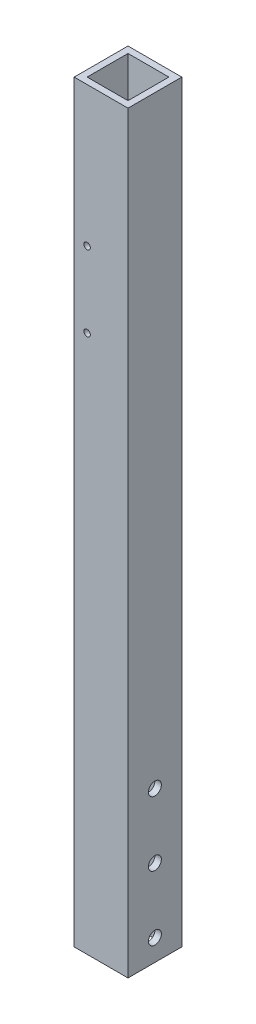
ISO-10303-21;
HEADER;
FILE_DESCRIPTION(('STEP AP214'),'2;1');
FILE_NAME('part.step','',(''),(''),'','','');
FILE_SCHEMA(('AUTOMOTIVE_DESIGN { 1 0 10303 214 1 1 1 1 }'));
ENDSEC;
DATA;
#1=APPLICATION_CONTEXT('core data for automotive mechanical design processes');
#2=APPLICATION_PROTOCOL_DEFINITION('international standard','automotive_design',2000,#1);
#3=PRODUCT_CONTEXT('',#1,'mechanical');
#4=PRODUCT('Part','Part','',(#3));
#5=PRODUCT_RELATED_PRODUCT_CATEGORY('part','',(#4));
#6=PRODUCT_DEFINITION_FORMATION('','',#4);
#7=PRODUCT_DEFINITION_CONTEXT('part definition',#1,'design');
#8=PRODUCT_DEFINITION('design','',#6,#7);
#9=PRODUCT_DEFINITION_SHAPE('','',#8);
#10=(LENGTH_UNIT() NAMED_UNIT(*) SI_UNIT(.MILLI.,.METRE.));
#11=(NAMED_UNIT(*) PLANE_ANGLE_UNIT() SI_UNIT($,.RADIAN.));
#12=(NAMED_UNIT(*) SI_UNIT($,.STERADIAN.) SOLID_ANGLE_UNIT());
#13=UNCERTAINTY_MEASURE_WITH_UNIT(LENGTH_MEASURE(1.E-05),#10,'distance_accuracy_value','');
#14=(GEOMETRIC_REPRESENTATION_CONTEXT(3) GLOBAL_UNCERTAINTY_ASSIGNED_CONTEXT((#13)) GLOBAL_UNIT_ASSIGNED_CONTEXT((#10,
#11,#12)) REPRESENTATION_CONTEXT('',''));
#15=CARTESIAN_POINT('',(0.,0.,0.));
#16=DIRECTION('',(0.,0.,1.));
#17=DIRECTION('',(1.,0.,0.));
#18=AXIS2_PLACEMENT_3D('',#15,#16,#17);
#19=CARTESIAN_POINT('',(0.,350.,0.));
#20=DIRECTION('',(0.,-1.,0.));
#21=DIRECTION('',(0.,0.,-1.));
#22=AXIS2_PLACEMENT_3D('',#19,#20,#21);
#23=PLANE('',#22);
#24=DIRECTION('',(0.,0.,1.));
#25=VECTOR('',#24,1.);
#26=CARTESIAN_POINT('',(0.,350.,0.));
#27=LINE('',#26,#25);
#28=CARTESIAN_POINT('',(0.,350.,-25.));
#29=VERTEX_POINT('',#28);
#30=CARTESIAN_POINT('',(0.,350.,0.));
#31=VERTEX_POINT('',#30);
#32=EDGE_CURVE('E140',#29,#31,#27,.T.);
#33=ORIENTED_EDGE('',*,*,#32,.T.);
#34=DIRECTION('',(1.,0.,0.));
#35=VECTOR('',#34,1.);
#36=CARTESIAN_POINT('',(0.,350.,0.));
#37=LINE('',#36,#35);
#38=CARTESIAN_POINT('',(25.,350.,0.));
#39=VERTEX_POINT('',#38);
#40=EDGE_CURVE('E143',#31,#39,#37,.T.);
#41=ORIENTED_EDGE('',*,*,#40,.T.);
#42=DIRECTION('',(0.,0.,-1.));
#43=VECTOR('',#42,1.);
#44=CARTESIAN_POINT('',(25.,350.,0.));
#45=LINE('',#44,#43);
#46=CARTESIAN_POINT('',(25.,350.,-25.));
#47=VERTEX_POINT('',#46);
#48=EDGE_CURVE('E146',#39,#47,#45,.T.);
#49=ORIENTED_EDGE('',*,*,#48,.T.);
#50=DIRECTION('',(-1.,0.,0.));
#51=VECTOR('',#50,1.);
#52=CARTESIAN_POINT('',(0.,350.,-25.));
#53=LINE('',#52,#51);
#54=EDGE_CURVE('E148',#47,#29,#53,.T.);
#55=ORIENTED_EDGE('',*,*,#54,.T.);
#56=EDGE_LOOP('',(#33,#41,#49,#55));
#57=FACE_BOUND('',#56,.T.);
#58=DIRECTION('',(0.,0.,1.));
#59=VECTOR('',#58,1.);
#60=CARTESIAN_POINT('',(3.,350.,-3.));
#61=LINE('',#60,#59);
#62=CARTESIAN_POINT('',(3.,350.,-22.));
#63=VERTEX_POINT('',#62);
#64=CARTESIAN_POINT('',(3.,350.,-3.));
#65=VERTEX_POINT('',#64);
#66=EDGE_CURVE('E102',#63,#65,#61,.T.);
#67=ORIENTED_EDGE('',*,*,#66,.F.);
#68=DIRECTION('',(-1.,0.,0.));
#69=VECTOR('',#68,1.);
#70=CARTESIAN_POINT('',(3.,350.,-22.));
#71=LINE('',#70,#69);
#72=CARTESIAN_POINT('',(22.,350.,-22.));
#73=VERTEX_POINT('',#72);
#74=EDGE_CURVE('E124',#73,#63,#71,.T.);
#75=ORIENTED_EDGE('',*,*,#74,.F.);
#76=DIRECTION('',(0.,0.,-1.));
#77=VECTOR('',#76,1.);
#78=CARTESIAN_POINT('',(22.,350.,-3.));
#79=LINE('',#78,#77);
#80=CARTESIAN_POINT('',(22.,350.,-3.));
#81=VERTEX_POINT('',#80);
#82=EDGE_CURVE('E122',#81,#73,#79,.T.);
#83=ORIENTED_EDGE('',*,*,#82,.F.);
#84=DIRECTION('',(1.,0.,0.));
#85=VECTOR('',#84,1.);
#86=CARTESIAN_POINT('',(3.,350.,-3.));
#87=LINE('',#86,#85);
#88=EDGE_CURVE('E110',#65,#81,#87,.T.);
#89=ORIENTED_EDGE('',*,*,#88,.F.);
#90=EDGE_LOOP('',(#67,#75,#83,#89));
#91=FACE_BOUND('',#90,.T.);
#92=ADVANCED_FACE('F35',(#57,#91),#23,.F.);
#93=CARTESIAN_POINT('',(0.,0.,0.));
#94=DIRECTION('',(0.,-1.,0.));
#95=DIRECTION('',(0.,0.,-1.));
#96=AXIS2_PLACEMENT_3D('',#93,#94,#95);
#97=PLANE('',#96);
#98=DIRECTION('',(0.,0.,1.));
#99=VECTOR('',#98,1.);
#100=CARTESIAN_POINT('',(0.,0.,0.));
#101=LINE('',#100,#99);
#102=CARTESIAN_POINT('',(0.,0.,-25.));
#103=VERTEX_POINT('',#102);
#104=CARTESIAN_POINT('',(0.,0.,0.));
#105=VERTEX_POINT('',#104);
#106=EDGE_CURVE('E118',#103,#105,#101,.T.);
#107=ORIENTED_EDGE('',*,*,#106,.F.);
#108=DIRECTION('',(-1.,0.,0.));
#109=VECTOR('',#108,1.);
#110=CARTESIAN_POINT('',(0.,0.,-25.));
#111=LINE('',#110,#109);
#112=CARTESIAN_POINT('',(25.,0.,-25.));
#113=VERTEX_POINT('',#112);
#114=EDGE_CURVE('E144',#113,#103,#111,.T.);
#115=ORIENTED_EDGE('',*,*,#114,.F.);
#116=DIRECTION('',(0.,0.,-1.));
#117=VECTOR('',#116,1.);
#118=CARTESIAN_POINT('',(25.,0.,0.));
#119=LINE('',#118,#117);
#120=CARTESIAN_POINT('',(25.,0.,0.));
#121=VERTEX_POINT('',#120);
#122=EDGE_CURVE('E155',#121,#113,#119,.T.);
#123=ORIENTED_EDGE('',*,*,#122,.F.);
#124=DIRECTION('',(1.,0.,0.));
#125=VECTOR('',#124,1.);
#126=CARTESIAN_POINT('',(0.,0.,0.));
#127=LINE('',#126,#125);
#128=EDGE_CURVE('E153',#105,#121,#127,.T.);
#129=ORIENTED_EDGE('',*,*,#128,.F.);
#130=EDGE_LOOP('',(#107,#115,#123,#129));
#131=FACE_BOUND('',#130,.T.);
#132=DIRECTION('',(-1.,0.,0.));
#133=VECTOR('',#132,1.);
#134=CARTESIAN_POINT('',(3.,0.,-22.));
#135=LINE('',#134,#133);
#136=CARTESIAN_POINT('',(22.,0.,-22.));
#137=VERTEX_POINT('',#136);
#138=CARTESIAN_POINT('',(3.,0.,-22.));
#139=VERTEX_POINT('',#138);
#140=EDGE_CURVE('E111',#137,#139,#135,.T.);
#141=ORIENTED_EDGE('',*,*,#140,.T.);
#142=DIRECTION('',(0.,0.,1.));
#143=VECTOR('',#142,1.);
#144=CARTESIAN_POINT('',(3.,0.,-3.));
#145=LINE('',#144,#143);
#146=CARTESIAN_POINT('',(3.,0.,-3.));
#147=VERTEX_POINT('',#146);
#148=EDGE_CURVE('E60',#139,#147,#145,.T.);
#149=ORIENTED_EDGE('',*,*,#148,.T.);
#150=DIRECTION('',(1.,0.,0.));
#151=VECTOR('',#150,1.);
#152=CARTESIAN_POINT('',(3.,0.,-3.));
#153=LINE('',#152,#151);
#154=CARTESIAN_POINT('',(22.,0.,-3.));
#155=VERTEX_POINT('',#154);
#156=EDGE_CURVE('E117',#147,#155,#153,.T.);
#157=ORIENTED_EDGE('',*,*,#156,.T.);
#158=DIRECTION('',(0.,0.,-1.));
#159=VECTOR('',#158,1.);
#160=CARTESIAN_POINT('',(22.,0.,-3.));
#161=LINE('',#160,#159);
#162=EDGE_CURVE('E132',#155,#137,#161,.T.);
#163=ORIENTED_EDGE('',*,*,#162,.T.);
#164=EDGE_LOOP('',(#141,#149,#157,#163));
#165=FACE_BOUND('',#164,.T.);
#166=ADVANCED_FACE('F238',(#131,#165),#97,.T.);
#167=CARTESIAN_POINT('',(0.,350.,0.));
#168=DIRECTION('',(1.,0.,0.));
#169=DIRECTION('',(0.,0.,-1.));
#170=AXIS2_PLACEMENT_3D('',#167,#168,#169);
#171=PLANE('',#170);
#172=CARTESIAN_POINT('',(0.,10.,-12.5));
#173=DIRECTION('',(1.,0.,0.));
#174=DIRECTION('',(0.,0.,-1.));
#175=AXIS2_PLACEMENT_3D('',#172,#173,#174);
#176=CIRCLE('',#175,3.);
#177=CARTESIAN_POINT('',(0.,10.,-15.5));
#178=VERTEX_POINT('',#177);
#179=EDGE_CURVE('E204',#178,#178,#176,.T.);
#180=ORIENTED_EDGE('',*,*,#179,.T.);
#181=EDGE_LOOP('',(#180));
#182=FACE_BOUND('',#181,.T.);
#183=CARTESIAN_POINT('',(0.,40.,-12.4999999999999));
#184=DIRECTION('',(1.,0.,0.));
#185=DIRECTION('',(0.,0.,-1.));
#186=AXIS2_PLACEMENT_3D('',#183,#184,#185);
#187=CIRCLE('',#186,3.);
#188=CARTESIAN_POINT('',(0.,40.,-15.4999999999999));
#189=VERTEX_POINT('',#188);
#190=EDGE_CURVE('E210',#189,#189,#187,.T.);
#191=ORIENTED_EDGE('',*,*,#190,.T.);
#192=EDGE_LOOP('',(#191));
#193=FACE_BOUND('',#192,.T.);
#194=CARTESIAN_POINT('',(0.,70.,-12.4999999999998));
#195=DIRECTION('',(1.,0.,0.));
#196=DIRECTION('',(0.,0.,-1.));
#197=AXIS2_PLACEMENT_3D('',#194,#195,#196);
#198=CIRCLE('',#197,3.);
#199=CARTESIAN_POINT('',(0.,70.,-15.4999999999998));
#200=VERTEX_POINT('',#199);
#201=EDGE_CURVE('E201',#200,#200,#198,.T.);
#202=ORIENTED_EDGE('',*,*,#201,.T.);
#203=EDGE_LOOP('',(#202));
#204=FACE_BOUND('',#203,.T.);
#205=ORIENTED_EDGE('',*,*,#106,.T.);
#206=DIRECTION('',(0.,-1.,0.));
#207=VECTOR('',#206,1.);
#208=CARTESIAN_POINT('',(0.,350.,0.));
#209=LINE('',#208,#207);
#210=EDGE_CURVE('E11',#31,#105,#209,.T.);
#211=ORIENTED_EDGE('',*,*,#210,.F.);
#212=ORIENTED_EDGE('',*,*,#32,.F.);
#213=DIRECTION('',(0.,-1.,0.));
#214=VECTOR('',#213,1.);
#215=CARTESIAN_POINT('',(0.,350.,-25.));
#216=LINE('',#215,#214);
#217=EDGE_CURVE('E150',#29,#103,#216,.T.);
#218=ORIENTED_EDGE('',*,*,#217,.T.);
#219=EDGE_LOOP('',(#205,#211,#212,#218));
#220=FACE_BOUND('',#219,.T.);
#221=ADVANCED_FACE('F37',(#182,#193,#204,#220),#171,.F.);
#222=CARTESIAN_POINT('',(0.,350.,0.));
#223=DIRECTION('',(0.,0.,-1.));
#224=DIRECTION('',(-1.,0.,0.));
#225=AXIS2_PLACEMENT_3D('',#222,#223,#224);
#226=PLANE('',#225);
#227=CARTESIAN_POINT('',(6.,250.,0.));
#228=DIRECTION('',(0.,0.,1.));
#229=DIRECTION('',(1.,0.,0.));
#230=AXIS2_PLACEMENT_3D('',#227,#228,#229);
#231=CIRCLE('',#230,1.5);
#232=CARTESIAN_POINT('',(7.5,250.,0.));
#233=VERTEX_POINT('',#232);
#234=EDGE_CURVE('E185',#233,#233,#231,.T.);
#235=ORIENTED_EDGE('',*,*,#234,.F.);
#236=EDGE_LOOP('',(#235));
#237=FACE_BOUND('',#236,.T.);
#238=CARTESIAN_POINT('',(5.99999999999988,285.,0.));
#239=DIRECTION('',(0.,0.,1.));
#240=DIRECTION('',(1.,0.,0.));
#241=AXIS2_PLACEMENT_3D('',#238,#239,#240);
#242=CIRCLE('',#241,1.5);
#243=CARTESIAN_POINT('',(7.49999999999988,285.,0.));
#244=VERTEX_POINT('',#243);
#245=EDGE_CURVE('E195',#244,#244,#242,.T.);
#246=ORIENTED_EDGE('',*,*,#245,.F.);
#247=EDGE_LOOP('',(#246));
#248=FACE_BOUND('',#247,.T.);
#249=ORIENTED_EDGE('',*,*,#128,.T.);
#250=DIRECTION('',(0.,-1.,0.));
#251=VECTOR('',#250,1.);
#252=CARTESIAN_POINT('',(25.,350.,0.));
#253=LINE('',#252,#251);
#254=EDGE_CURVE('E44',#39,#121,#253,.T.);
#255=ORIENTED_EDGE('',*,*,#254,.F.);
#256=ORIENTED_EDGE('',*,*,#40,.F.);
#257=ORIENTED_EDGE('',*,*,#210,.T.);
#258=EDGE_LOOP('',(#249,#255,#256,#257));
#259=FACE_BOUND('',#258,.T.);
#260=ADVANCED_FACE('F237',(#237,#248,#259),#226,.F.);
#261=CARTESIAN_POINT('',(25.,350.,0.));
#262=DIRECTION('',(-1.,0.,0.));
#263=DIRECTION('',(0.,0.,1.));
#264=AXIS2_PLACEMENT_3D('',#261,#262,#263);
#265=PLANE('',#264);
#266=CARTESIAN_POINT('',(25.,10.,-12.5));
#267=DIRECTION('',(1.,0.,0.));
#268=DIRECTION('',(0.,0.,-1.));
#269=AXIS2_PLACEMENT_3D('',#266,#267,#268);
#270=CIRCLE('',#269,3.);
#271=CARTESIAN_POINT('',(25.,10.,-15.5));
#272=VERTEX_POINT('',#271);
#273=EDGE_CURVE('E169',#272,#272,#270,.T.);
#274=ORIENTED_EDGE('',*,*,#273,.F.);
#275=EDGE_LOOP('',(#274));
#276=FACE_BOUND('',#275,.T.);
#277=CARTESIAN_POINT('',(25.,40.,-12.4999999999999));
#278=DIRECTION('',(1.,0.,0.));
#279=DIRECTION('',(0.,0.,-1.));
#280=AXIS2_PLACEMENT_3D('',#277,#278,#279);
#281=CIRCLE('',#280,3.);
#282=CARTESIAN_POINT('',(25.,40.,-15.4999999999999));
#283=VERTEX_POINT('',#282);
#284=EDGE_CURVE('E207',#283,#283,#281,.T.);
#285=ORIENTED_EDGE('',*,*,#284,.F.);
#286=EDGE_LOOP('',(#285));
#287=FACE_BOUND('',#286,.T.);
#288=CARTESIAN_POINT('',(25.,70.,-12.4999999999998));
#289=DIRECTION('',(1.,0.,0.));
#290=DIRECTION('',(0.,0.,-1.));
#291=AXIS2_PLACEMENT_3D('',#288,#289,#290);
#292=CIRCLE('',#291,3.);
#293=CARTESIAN_POINT('',(25.,70.,-15.4999999999998));
#294=VERTEX_POINT('',#293);
#295=EDGE_CURVE('E213',#294,#294,#292,.T.);
#296=ORIENTED_EDGE('',*,*,#295,.F.);
#297=EDGE_LOOP('',(#296));
#298=FACE_BOUND('',#297,.T.);
#299=ORIENTED_EDGE('',*,*,#122,.T.);
#300=DIRECTION('',(0.,-1.,0.));
#301=VECTOR('',#300,1.);
#302=CARTESIAN_POINT('',(25.,350.,-25.));
#303=LINE('',#302,#301);
#304=EDGE_CURVE('E160',#47,#113,#303,.T.);
#305=ORIENTED_EDGE('',*,*,#304,.F.);
#306=ORIENTED_EDGE('',*,*,#48,.F.);
#307=ORIENTED_EDGE('',*,*,#254,.T.);
#308=EDGE_LOOP('',(#299,#305,#306,#307));
#309=FACE_BOUND('',#308,.T.);
#310=ADVANCED_FACE('F260',(#276,#287,#298,#309),#265,.F.);
#311=CARTESIAN_POINT('',(0.,350.,-25.));
#312=DIRECTION('',(0.,0.,1.));
#313=DIRECTION('',(1.,0.,0.));
#314=AXIS2_PLACEMENT_3D('',#311,#312,#313);
#315=PLANE('',#314);
#316=CARTESIAN_POINT('',(6.,250.,-25.));
#317=DIRECTION('',(0.,0.,1.));
#318=DIRECTION('',(1.,0.,0.));
#319=AXIS2_PLACEMENT_3D('',#316,#317,#318);
#320=CIRCLE('',#319,1.5);
#321=CARTESIAN_POINT('',(7.5,250.,-25.));
#322=VERTEX_POINT('',#321);
#323=EDGE_CURVE('E179',#322,#322,#320,.T.);
#324=ORIENTED_EDGE('',*,*,#323,.T.);
#325=EDGE_LOOP('',(#324));
#326=FACE_BOUND('',#325,.T.);
#327=CARTESIAN_POINT('',(5.99999999999988,285.,-25.));
#328=DIRECTION('',(0.,0.,1.));
#329=DIRECTION('',(1.,0.,0.));
#330=AXIS2_PLACEMENT_3D('',#327,#328,#329);
#331=CIRCLE('',#330,1.5);
#332=CARTESIAN_POINT('',(7.49999999999988,285.,-25.));
#333=VERTEX_POINT('',#332);
#334=EDGE_CURVE('E190',#333,#333,#331,.T.);
#335=ORIENTED_EDGE('',*,*,#334,.T.);
#336=EDGE_LOOP('',(#335));
#337=FACE_BOUND('',#336,.T.);
#338=ORIENTED_EDGE('',*,*,#114,.T.);
#339=ORIENTED_EDGE('',*,*,#217,.F.);
#340=ORIENTED_EDGE('',*,*,#54,.F.);
#341=ORIENTED_EDGE('',*,*,#304,.T.);
#342=EDGE_LOOP('',(#338,#339,#340,#341));
#343=FACE_BOUND('',#342,.T.);
#344=ADVANCED_FACE('F258',(#326,#337,#343),#315,.F.);
#345=CARTESIAN_POINT('',(3.,350.,-3.));
#346=DIRECTION('',(1.,0.,0.));
#347=DIRECTION('',(0.,0.,-1.));
#348=AXIS2_PLACEMENT_3D('',#345,#346,#347);
#349=PLANE('',#348);
#350=CARTESIAN_POINT('',(3.,10.,-12.5));
#351=DIRECTION('',(1.,0.,0.));
#352=DIRECTION('',(0.,0.,-1.));
#353=AXIS2_PLACEMENT_3D('',#350,#351,#352);
#354=CIRCLE('',#353,3.);
#355=CARTESIAN_POINT('',(3.,10.,-15.5));
#356=VERTEX_POINT('',#355);
#357=EDGE_CURVE('E130',#356,#356,#354,.F.);
#358=ORIENTED_EDGE('',*,*,#357,.T.);
#359=EDGE_LOOP('',(#358));
#360=FACE_BOUND('',#359,.T.);
#361=CARTESIAN_POINT('',(3.,40.,-12.4999999999999));
#362=DIRECTION('',(1.,0.,0.));
#363=DIRECTION('',(0.,0.,-1.));
#364=AXIS2_PLACEMENT_3D('',#361,#362,#363);
#365=CIRCLE('',#364,3.);
#366=CARTESIAN_POINT('',(3.,40.,-15.4999999999999));
#367=VERTEX_POINT('',#366);
#368=EDGE_CURVE('E173',#367,#367,#365,.F.);
#369=ORIENTED_EDGE('',*,*,#368,.T.);
#370=EDGE_LOOP('',(#369));
#371=FACE_BOUND('',#370,.T.);
#372=CARTESIAN_POINT('',(3.,70.,-12.4999999999998));
#373=DIRECTION('',(1.,0.,0.));
#374=DIRECTION('',(0.,0.,-1.));
#375=AXIS2_PLACEMENT_3D('',#372,#373,#374);
#376=CIRCLE('',#375,3.);
#377=CARTESIAN_POINT('',(3.,70.,-15.4999999999998));
#378=VERTEX_POINT('',#377);
#379=EDGE_CURVE('E168',#378,#378,#376,.F.);
#380=ORIENTED_EDGE('',*,*,#379,.T.);
#381=EDGE_LOOP('',(#380));
#382=FACE_BOUND('',#381,.T.);
#383=ORIENTED_EDGE('',*,*,#148,.F.);
#384=DIRECTION('',(0.,-1.,0.));
#385=VECTOR('',#384,1.);
#386=CARTESIAN_POINT('',(3.,350.,-22.));
#387=LINE('',#386,#385);
#388=EDGE_CURVE('E106',#63,#139,#387,.T.);
#389=ORIENTED_EDGE('',*,*,#388,.F.);
#390=ORIENTED_EDGE('',*,*,#66,.T.);
#391=DIRECTION('',(0.,-1.,0.));
#392=VECTOR('',#391,1.);
#393=CARTESIAN_POINT('',(3.,350.,-3.));
#394=LINE('',#393,#392);
#395=EDGE_CURVE('E105',#65,#147,#394,.T.);
#396=ORIENTED_EDGE('',*,*,#395,.T.);
#397=EDGE_LOOP('',(#383,#389,#390,#396));
#398=FACE_BOUND('',#397,.T.);
#399=ADVANCED_FACE('F104',(#360,#371,#382,#398),#349,.T.);
#400=CARTESIAN_POINT('',(3.,350.,-3.));
#401=DIRECTION('',(0.,0.,-1.));
#402=DIRECTION('',(-1.,0.,0.));
#403=AXIS2_PLACEMENT_3D('',#400,#401,#402);
#404=PLANE('',#403);
#405=CARTESIAN_POINT('',(6.,250.,-3.));
#406=DIRECTION('',(0.,0.,-1.));
#407=DIRECTION('',(-1.,0.,0.));
#408=AXIS2_PLACEMENT_3D('',#405,#406,#407);
#409=CIRCLE('',#408,1.5);
#410=CARTESIAN_POINT('',(4.5,250.,-3.));
#411=VERTEX_POINT('',#410);
#412=EDGE_CURVE('E198',#411,#411,#409,.T.);
#413=ORIENTED_EDGE('',*,*,#412,.F.);
#414=EDGE_LOOP('',(#413));
#415=FACE_BOUND('',#414,.T.);
#416=CARTESIAN_POINT('',(5.99999999999988,285.,-3.));
#417=DIRECTION('',(0.,0.,-1.));
#418=DIRECTION('',(-1.,0.,0.));
#419=AXIS2_PLACEMENT_3D('',#416,#417,#418);
#420=CIRCLE('',#419,1.5);
#421=CARTESIAN_POINT('',(4.49999999999988,285.,-3.));
#422=VERTEX_POINT('',#421);
#423=EDGE_CURVE('E178',#422,#422,#420,.T.);
#424=ORIENTED_EDGE('',*,*,#423,.F.);
#425=EDGE_LOOP('',(#424));
#426=FACE_BOUND('',#425,.T.);
#427=ORIENTED_EDGE('',*,*,#156,.F.);
#428=ORIENTED_EDGE('',*,*,#395,.F.);
#429=ORIENTED_EDGE('',*,*,#88,.T.);
#430=DIRECTION('',(0.,-1.,0.));
#431=VECTOR('',#430,1.);
#432=CARTESIAN_POINT('',(22.,350.,-3.));
#433=LINE('',#432,#431);
#434=EDGE_CURVE('E119',#81,#155,#433,.T.);
#435=ORIENTED_EDGE('',*,*,#434,.T.);
#436=EDGE_LOOP('',(#427,#428,#429,#435));
#437=FACE_BOUND('',#436,.T.);
#438=ADVANCED_FACE('F114',(#415,#426,#437),#404,.T.);
#439=CARTESIAN_POINT('',(22.,350.,-3.));
#440=DIRECTION('',(-1.,0.,0.));
#441=DIRECTION('',(0.,0.,1.));
#442=AXIS2_PLACEMENT_3D('',#439,#440,#441);
#443=PLANE('',#442);
#444=CARTESIAN_POINT('',(22.,10.,-12.5));
#445=DIRECTION('',(-1.,0.,0.));
#446=DIRECTION('',(0.,0.,1.));
#447=AXIS2_PLACEMENT_3D('',#444,#445,#446);
#448=CIRCLE('',#447,3.);
#449=CARTESIAN_POINT('',(22.,10.,-9.5));
#450=VERTEX_POINT('',#449);
#451=EDGE_CURVE('E174',#450,#450,#448,.F.);
#452=ORIENTED_EDGE('',*,*,#451,.T.);
#453=EDGE_LOOP('',(#452));
#454=FACE_BOUND('',#453,.T.);
#455=CARTESIAN_POINT('',(22.,40.,-12.4999999999999));
#456=DIRECTION('',(-1.,0.,0.));
#457=DIRECTION('',(0.,0.,1.));
#458=AXIS2_PLACEMENT_3D('',#455,#456,#457);
#459=CIRCLE('',#458,3.);
#460=CARTESIAN_POINT('',(22.,40.,-9.4999999999999));
#461=VERTEX_POINT('',#460);
#462=EDGE_CURVE('E170',#461,#461,#459,.F.);
#463=ORIENTED_EDGE('',*,*,#462,.T.);
#464=EDGE_LOOP('',(#463));
#465=FACE_BOUND('',#464,.T.);
#466=CARTESIAN_POINT('',(22.,70.,-12.4999999999998));
#467=DIRECTION('',(-1.,0.,0.));
#468=DIRECTION('',(0.,0.,1.));
#469=AXIS2_PLACEMENT_3D('',#466,#467,#468);
#470=CIRCLE('',#469,3.);
#471=CARTESIAN_POINT('',(22.,70.,-9.49999999999979));
#472=VERTEX_POINT('',#471);
#473=EDGE_CURVE('E165',#472,#472,#470,.F.);
#474=ORIENTED_EDGE('',*,*,#473,.T.);
#475=EDGE_LOOP('',(#474));
#476=FACE_BOUND('',#475,.T.);
#477=ORIENTED_EDGE('',*,*,#162,.F.);
#478=ORIENTED_EDGE('',*,*,#434,.F.);
#479=ORIENTED_EDGE('',*,*,#82,.T.);
#480=DIRECTION('',(0.,-1.,0.));
#481=VECTOR('',#480,1.);
#482=CARTESIAN_POINT('',(22.,350.,-22.));
#483=LINE('',#482,#481);
#484=EDGE_CURVE('E52',#73,#137,#483,.T.);
#485=ORIENTED_EDGE('',*,*,#484,.T.);
#486=EDGE_LOOP('',(#477,#478,#479,#485));
#487=FACE_BOUND('',#486,.T.);
#488=ADVANCED_FACE('F283',(#454,#465,#476,#487),#443,.T.);
#489=CARTESIAN_POINT('',(3.,350.,-22.));
#490=DIRECTION('',(0.,0.,1.));
#491=DIRECTION('',(1.,0.,0.));
#492=AXIS2_PLACEMENT_3D('',#489,#490,#491);
#493=PLANE('',#492);
#494=CARTESIAN_POINT('',(6.,250.,-22.));
#495=DIRECTION('',(0.,0.,1.));
#496=DIRECTION('',(1.,0.,0.));
#497=AXIS2_PLACEMENT_3D('',#494,#495,#496);
#498=CIRCLE('',#497,1.5);
#499=CARTESIAN_POINT('',(7.5,250.,-22.));
#500=VERTEX_POINT('',#499);
#501=EDGE_CURVE('E39',#500,#500,#498,.T.);
#502=ORIENTED_EDGE('',*,*,#501,.F.);
#503=EDGE_LOOP('',(#502));
#504=FACE_BOUND('',#503,.T.);
#505=CARTESIAN_POINT('',(5.99999999999988,285.,-22.));
#506=DIRECTION('',(0.,0.,1.));
#507=DIRECTION('',(1.,0.,0.));
#508=AXIS2_PLACEMENT_3D('',#505,#506,#507);
#509=CIRCLE('',#508,1.5);
#510=CARTESIAN_POINT('',(7.49999999999988,285.,-22.));
#511=VERTEX_POINT('',#510);
#512=EDGE_CURVE('E176',#511,#511,#509,.T.);
#513=ORIENTED_EDGE('',*,*,#512,.F.);
#514=EDGE_LOOP('',(#513));
#515=FACE_BOUND('',#514,.T.);
#516=ORIENTED_EDGE('',*,*,#140,.F.);
#517=ORIENTED_EDGE('',*,*,#484,.F.);
#518=ORIENTED_EDGE('',*,*,#74,.T.);
#519=ORIENTED_EDGE('',*,*,#388,.T.);
#520=EDGE_LOOP('',(#516,#517,#518,#519));
#521=FACE_BOUND('',#520,.T.);
#522=ADVANCED_FACE('F287',(#504,#515,#521),#493,.T.);
#523=CARTESIAN_POINT('',(25.,70.,-12.4999999999998));
#524=DIRECTION('',(-1.,0.,0.));
#525=DIRECTION('',(0.,0.,1.));
#526=AXIS2_PLACEMENT_3D('',#523,#524,#525);
#527=CYLINDRICAL_SURFACE('',#526,3.);
#528=ORIENTED_EDGE('',*,*,#473,.F.);
#529=EDGE_LOOP('',(#528));
#530=FACE_BOUND('',#529,.T.);
#531=ORIENTED_EDGE('',*,*,#295,.T.);
#532=EDGE_LOOP('',(#531));
#533=FACE_BOUND('',#532,.T.);
#534=ADVANCED_FACE('F291',(#530,#533),#527,.F.);
#535=CARTESIAN_POINT('',(25.,40.,-12.4999999999999));
#536=DIRECTION('',(-1.,0.,0.));
#537=DIRECTION('',(0.,0.,1.));
#538=AXIS2_PLACEMENT_3D('',#535,#536,#537);
#539=CYLINDRICAL_SURFACE('',#538,3.);
#540=ORIENTED_EDGE('',*,*,#462,.F.);
#541=EDGE_LOOP('',(#540));
#542=FACE_BOUND('',#541,.T.);
#543=ORIENTED_EDGE('',*,*,#284,.T.);
#544=EDGE_LOOP('',(#543));
#545=FACE_BOUND('',#544,.T.);
#546=ADVANCED_FACE('F295',(#542,#545),#539,.F.);
#547=CARTESIAN_POINT('',(25.,10.,-12.5));
#548=DIRECTION('',(-1.,0.,0.));
#549=DIRECTION('',(0.,0.,1.));
#550=AXIS2_PLACEMENT_3D('',#547,#548,#549);
#551=CYLINDRICAL_SURFACE('',#550,3.);
#552=ORIENTED_EDGE('',*,*,#451,.F.);
#553=EDGE_LOOP('',(#552));
#554=FACE_BOUND('',#553,.T.);
#555=ORIENTED_EDGE('',*,*,#273,.T.);
#556=EDGE_LOOP('',(#555));
#557=FACE_BOUND('',#556,.T.);
#558=ADVANCED_FACE('F232',(#554,#557),#551,.F.);
#559=ORIENTED_EDGE('',*,*,#379,.F.);
#560=EDGE_LOOP('',(#559));
#561=FACE_BOUND('',#560,.T.);
#562=ORIENTED_EDGE('',*,*,#201,.F.);
#563=EDGE_LOOP('',(#562));
#564=FACE_BOUND('',#563,.T.);
#565=ADVANCED_FACE('F297',(#561,#564),#527,.F.);
#566=ORIENTED_EDGE('',*,*,#368,.F.);
#567=EDGE_LOOP('',(#566));
#568=FACE_BOUND('',#567,.T.);
#569=ORIENTED_EDGE('',*,*,#190,.F.);
#570=EDGE_LOOP('',(#569));
#571=FACE_BOUND('',#570,.T.);
#572=ADVANCED_FACE('F230',(#568,#571),#539,.F.);
#573=ORIENTED_EDGE('',*,*,#357,.F.);
#574=EDGE_LOOP('',(#573));
#575=FACE_BOUND('',#574,.T.);
#576=ORIENTED_EDGE('',*,*,#179,.F.);
#577=EDGE_LOOP('',(#576));
#578=FACE_BOUND('',#577,.T.);
#579=ADVANCED_FACE('F226',(#575,#578),#551,.F.);
#580=CARTESIAN_POINT('',(5.99999999999988,285.,-25.));
#581=DIRECTION('',(0.,0.,1.));
#582=DIRECTION('',(1.,0.,0.));
#583=AXIS2_PLACEMENT_3D('',#580,#581,#582);
#584=CYLINDRICAL_SURFACE('',#583,1.5);
#585=ORIENTED_EDGE('',*,*,#512,.T.);
#586=EDGE_LOOP('',(#585));
#587=FACE_BOUND('',#586,.T.);
#588=ORIENTED_EDGE('',*,*,#334,.F.);
#589=EDGE_LOOP('',(#588));
#590=FACE_BOUND('',#589,.T.);
#591=ADVANCED_FACE('F229',(#587,#590),#584,.F.);
#592=CARTESIAN_POINT('',(6.,250.,-25.));
#593=DIRECTION('',(0.,0.,1.));
#594=DIRECTION('',(1.,0.,0.));
#595=AXIS2_PLACEMENT_3D('',#592,#593,#594);
#596=CYLINDRICAL_SURFACE('',#595,1.5);
#597=ORIENTED_EDGE('',*,*,#501,.T.);
#598=EDGE_LOOP('',(#597));
#599=FACE_BOUND('',#598,.T.);
#600=ORIENTED_EDGE('',*,*,#323,.F.);
#601=EDGE_LOOP('',(#600));
#602=FACE_BOUND('',#601,.T.);
#603=ADVANCED_FACE('F305',(#599,#602),#596,.F.);
#604=ORIENTED_EDGE('',*,*,#423,.T.);
#605=EDGE_LOOP('',(#604));
#606=FACE_BOUND('',#605,.T.);
#607=ORIENTED_EDGE('',*,*,#245,.T.);
#608=EDGE_LOOP('',(#607));
#609=FACE_BOUND('',#608,.T.);
#610=ADVANCED_FACE('F306',(#606,#609),#584,.F.);
#611=ORIENTED_EDGE('',*,*,#412,.T.);
#612=EDGE_LOOP('',(#611));
#613=FACE_BOUND('',#612,.T.);
#614=ORIENTED_EDGE('',*,*,#234,.T.);
#615=EDGE_LOOP('',(#614));
#616=FACE_BOUND('',#615,.T.);
#617=ADVANCED_FACE('F309',(#613,#616),#596,.F.);
#618=CLOSED_SHELL('',(#92,#166,#221,#260,#310,#344,#399,#438,#488,#522,#534,#546,#558,#565,#572,
#579,#591,#603,#610,#617));
#619=MANIFOLD_SOLID_BREP('B2',#618);
#620=ADVANCED_BREP_SHAPE_REPRESENTATION('',(#18,#619),#14);
#621=SHAPE_DEFINITION_REPRESENTATION(#9,#620);
ENDSEC;
END-ISO-10303-21;
